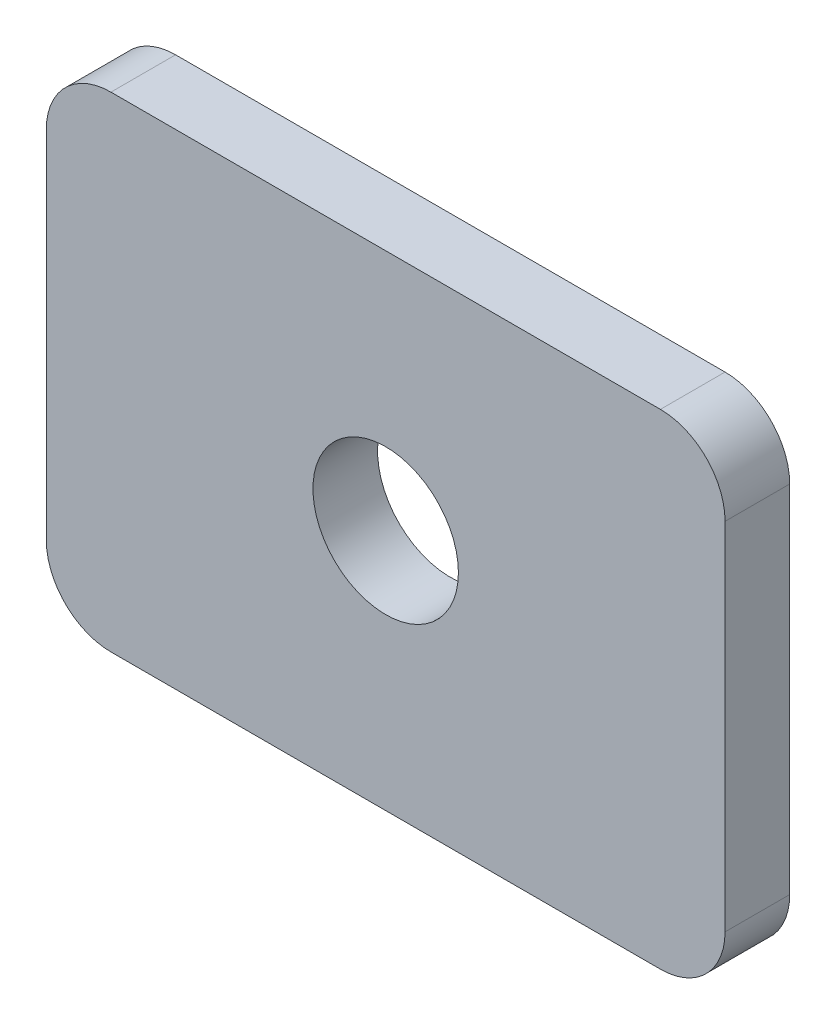
ISO-10303-21;
HEADER;
FILE_DESCRIPTION(('STEP AP214'),'2;1');
FILE_NAME('part.step','',(''),(''),'','','');
FILE_SCHEMA(('AUTOMOTIVE_DESIGN { 1 0 10303 214 1 1 1 1 }'));
ENDSEC;
DATA;
#1=APPLICATION_CONTEXT('core data for automotive mechanical design processes');
#2=APPLICATION_PROTOCOL_DEFINITION('international standard','automotive_design',2000,#1);
#3=PRODUCT_CONTEXT('',#1,'mechanical');
#4=PRODUCT('Part','Part','',(#3));
#5=PRODUCT_RELATED_PRODUCT_CATEGORY('part','',(#4));
#6=PRODUCT_DEFINITION_FORMATION('','',#4);
#7=PRODUCT_DEFINITION_CONTEXT('part definition',#1,'design');
#8=PRODUCT_DEFINITION('design','',#6,#7);
#9=PRODUCT_DEFINITION_SHAPE('','',#8);
#10=(LENGTH_UNIT() NAMED_UNIT(*) SI_UNIT(.MILLI.,.METRE.));
#11=(NAMED_UNIT(*) PLANE_ANGLE_UNIT() SI_UNIT($,.RADIAN.));
#12=(NAMED_UNIT(*) SI_UNIT($,.STERADIAN.) SOLID_ANGLE_UNIT());
#13=UNCERTAINTY_MEASURE_WITH_UNIT(LENGTH_MEASURE(1.E-05),#10,'distance_accuracy_value','');
#14=(GEOMETRIC_REPRESENTATION_CONTEXT(3) GLOBAL_UNCERTAINTY_ASSIGNED_CONTEXT((#13)) GLOBAL_UNIT_ASSIGNED_CONTEXT((#10,
#11,#12)) REPRESENTATION_CONTEXT('',''));
#15=CARTESIAN_POINT('',(0.,0.,0.));
#16=DIRECTION('',(0.,0.,1.));
#17=DIRECTION('',(1.,0.,0.));
#18=AXIS2_PLACEMENT_3D('',#15,#16,#17);
#19=CARTESIAN_POINT('',(10.5,7.5,-2.));
#20=DIRECTION('',(1.,0.,0.));
#21=DIRECTION('',(0.,0.,-1.));
#22=AXIS2_PLACEMENT_3D('',#19,#20,#21);
#23=PLANE('',#22);
#24=DIRECTION('',(0.,1.,0.));
#25=VECTOR('',#24,1.);
#26=CARTESIAN_POINT('',(10.5,7.5,-2.));
#27=LINE('',#26,#25);
#28=CARTESIAN_POINT('',(10.5,-5.5,-2.));
#29=VERTEX_POINT('',#28);
#30=CARTESIAN_POINT('',(10.5,5.5,-2.));
#31=VERTEX_POINT('',#30);
#32=EDGE_CURVE('E163',#29,#31,#27,.T.);
#33=ORIENTED_EDGE('',*,*,#32,.T.);
#34=DIRECTION('',(0.,0.,1.));
#35=VECTOR('',#34,1.);
#36=CARTESIAN_POINT('',(10.5,5.5,-2.));
#37=LINE('',#36,#35);
#38=CARTESIAN_POINT('',(10.5,5.5,0.));
#39=VERTEX_POINT('',#38);
#40=EDGE_CURVE('E117',#31,#39,#37,.T.);
#41=ORIENTED_EDGE('',*,*,#40,.T.);
#42=DIRECTION('',(0.,1.,0.));
#43=VECTOR('',#42,1.);
#44=CARTESIAN_POINT('',(10.5,7.5,0.));
#45=LINE('',#44,#43);
#46=CARTESIAN_POINT('',(10.5,-5.5,0.));
#47=VERTEX_POINT('',#46);
#48=EDGE_CURVE('E101',#47,#39,#45,.T.);
#49=ORIENTED_EDGE('',*,*,#48,.F.);
#50=DIRECTION('',(0.,0.,1.));
#51=VECTOR('',#50,1.);
#52=CARTESIAN_POINT('',(10.5,-5.5,-2.));
#53=LINE('',#52,#51);
#54=EDGE_CURVE('E114',#47,#29,#53,.F.);
#55=ORIENTED_EDGE('',*,*,#54,.T.);
#56=EDGE_LOOP('',(#33,#41,#49,#55));
#57=FACE_BOUND('',#56,.T.);
#58=ADVANCED_FACE('F32',(#57),#23,.T.);
#59=CARTESIAN_POINT('',(-10.5,-7.5,-2.));
#60=DIRECTION('',(0.,-1.,0.));
#61=DIRECTION('',(1.,0.,0.));
#62=AXIS2_PLACEMENT_3D('',#59,#60,#61);
#63=PLANE('',#62);
#64=DIRECTION('',(1.,0.,0.));
#65=VECTOR('',#64,1.);
#66=CARTESIAN_POINT('',(-10.5,-7.5,-2.));
#67=LINE('',#66,#65);
#68=CARTESIAN_POINT('',(-8.5,-7.5,-2.));
#69=VERTEX_POINT('',#68);
#70=CARTESIAN_POINT('',(8.49999999999999,-7.5,-2.));
#71=VERTEX_POINT('',#70);
#72=EDGE_CURVE('E124',#69,#71,#67,.T.);
#73=ORIENTED_EDGE('',*,*,#72,.T.);
#74=DIRECTION('',(0.,0.,1.));
#75=VECTOR('',#74,1.);
#76=CARTESIAN_POINT('',(8.5,-7.5,-2.));
#77=LINE('',#76,#75);
#78=CARTESIAN_POINT('',(8.49999999999999,-7.5,0.));
#79=VERTEX_POINT('',#78);
#80=EDGE_CURVE('E150',#71,#79,#77,.T.);
#81=ORIENTED_EDGE('',*,*,#80,.T.);
#82=DIRECTION('',(1.,0.,0.));
#83=VECTOR('',#82,1.);
#84=CARTESIAN_POINT('',(-10.5,-7.5,0.));
#85=LINE('',#84,#83);
#86=CARTESIAN_POINT('',(-8.5,-7.5,0.));
#87=VERTEX_POINT('',#86);
#88=EDGE_CURVE('E103',#87,#79,#85,.T.);
#89=ORIENTED_EDGE('',*,*,#88,.F.);
#90=DIRECTION('',(0.,0.,1.));
#91=VECTOR('',#90,1.);
#92=CARTESIAN_POINT('',(-8.5,-7.5,-2.));
#93=LINE('',#92,#91);
#94=EDGE_CURVE('E148',#87,#69,#93,.F.);
#95=ORIENTED_EDGE('',*,*,#94,.T.);
#96=EDGE_LOOP('',(#73,#81,#89,#95));
#97=FACE_BOUND('',#96,.T.);
#98=ADVANCED_FACE('F152',(#97),#63,.T.);
#99=CARTESIAN_POINT('',(-10.5,7.5,-2.));
#100=DIRECTION('',(-1.,0.,0.));
#101=DIRECTION('',(0.,0.,1.));
#102=AXIS2_PLACEMENT_3D('',#99,#100,#101);
#103=PLANE('',#102);
#104=DIRECTION('',(0.,-1.,0.));
#105=VECTOR('',#104,1.);
#106=CARTESIAN_POINT('',(-10.5,7.5,-2.));
#107=LINE('',#106,#105);
#108=CARTESIAN_POINT('',(-10.5,5.5,-2.));
#109=VERTEX_POINT('',#108);
#110=CARTESIAN_POINT('',(-10.5,-5.5,-2.));
#111=VERTEX_POINT('',#110);
#112=EDGE_CURVE('E129',#109,#111,#107,.T.);
#113=ORIENTED_EDGE('',*,*,#112,.T.);
#114=DIRECTION('',(0.,0.,1.));
#115=VECTOR('',#114,1.);
#116=CARTESIAN_POINT('',(-10.5,-5.5,-2.));
#117=LINE('',#116,#115);
#118=CARTESIAN_POINT('',(-10.5,-5.5,0.));
#119=VERTEX_POINT('',#118);
#120=EDGE_CURVE('E11',#111,#119,#117,.T.);
#121=ORIENTED_EDGE('',*,*,#120,.T.);
#122=DIRECTION('',(0.,-1.,0.));
#123=VECTOR('',#122,1.);
#124=CARTESIAN_POINT('',(-10.5,7.5,0.));
#125=LINE('',#124,#123);
#126=CARTESIAN_POINT('',(-10.5,5.5,0.));
#127=VERTEX_POINT('',#126);
#128=EDGE_CURVE('E161',#127,#119,#125,.T.);
#129=ORIENTED_EDGE('',*,*,#128,.F.);
#130=DIRECTION('',(0.,0.,1.));
#131=VECTOR('',#130,1.);
#132=CARTESIAN_POINT('',(-10.5,5.5,-2.));
#133=LINE('',#132,#131);
#134=EDGE_CURVE('E40',#127,#109,#133,.F.);
#135=ORIENTED_EDGE('',*,*,#134,.T.);
#136=EDGE_LOOP('',(#113,#121,#129,#135));
#137=FACE_BOUND('',#136,.T.);
#138=ADVANCED_FACE('F160',(#137),#103,.T.);
#139=CARTESIAN_POINT('',(-10.5,7.5,-2.));
#140=DIRECTION('',(0.,1.,0.));
#141=DIRECTION('',(-1.,0.,0.));
#142=AXIS2_PLACEMENT_3D('',#139,#140,#141);
#143=PLANE('',#142);
#144=DIRECTION('',(-1.,0.,0.));
#145=VECTOR('',#144,1.);
#146=CARTESIAN_POINT('',(-10.5,7.5,0.));
#147=LINE('',#146,#145);
#148=CARTESIAN_POINT('',(8.49999999999999,7.5,0.));
#149=VERTEX_POINT('',#148);
#150=CARTESIAN_POINT('',(-8.5,7.5,0.));
#151=VERTEX_POINT('',#150);
#152=EDGE_CURVE('E118',#149,#151,#147,.T.);
#153=ORIENTED_EDGE('',*,*,#152,.F.);
#154=DIRECTION('',(0.,0.,1.));
#155=VECTOR('',#154,1.);
#156=CARTESIAN_POINT('',(8.5,7.5,-2.));
#157=LINE('',#156,#155);
#158=CARTESIAN_POINT('',(8.49999999999999,7.5,-2.));
#159=VERTEX_POINT('',#158);
#160=EDGE_CURVE('E140',#149,#159,#157,.F.);
#161=ORIENTED_EDGE('',*,*,#160,.T.);
#162=DIRECTION('',(-1.,0.,0.));
#163=VECTOR('',#162,1.);
#164=CARTESIAN_POINT('',(-10.5,7.5,-2.));
#165=LINE('',#164,#163);
#166=CARTESIAN_POINT('',(-8.5,7.5,-2.));
#167=VERTEX_POINT('',#166);
#168=EDGE_CURVE('E167',#159,#167,#165,.T.);
#169=ORIENTED_EDGE('',*,*,#168,.T.);
#170=DIRECTION('',(0.,0.,1.));
#171=VECTOR('',#170,1.);
#172=CARTESIAN_POINT('',(-8.5,7.5,-2.));
#173=LINE('',#172,#171);
#174=EDGE_CURVE('E137',#167,#151,#173,.T.);
#175=ORIENTED_EDGE('',*,*,#174,.T.);
#176=EDGE_LOOP('',(#153,#161,#169,#175));
#177=FACE_BOUND('',#176,.T.);
#178=ADVANCED_FACE('F190',(#177),#143,.T.);
#179=CARTESIAN_POINT('',(0.,0.,-2.));
#180=DIRECTION('',(0.,0.,1.));
#181=DIRECTION('',(1.,0.,0.));
#182=AXIS2_PLACEMENT_3D('',#179,#180,#181);
#183=PLANE('',#182);
#184=CARTESIAN_POINT('',(0.,0.,-2.));
#185=DIRECTION('',(0.,0.,1.));
#186=DIRECTION('',(1.,0.,0.));
#187=AXIS2_PLACEMENT_3D('',#184,#185,#186);
#188=CIRCLE('',#187,2.25);
#189=CARTESIAN_POINT('',(2.25,0.,-2.));
#190=VERTEX_POINT('',#189);
#191=EDGE_CURVE('E119',#190,#190,#188,.T.);
#192=ORIENTED_EDGE('',*,*,#191,.T.);
#193=EDGE_LOOP('',(#192));
#194=FACE_BOUND('',#193,.T.);
#195=ORIENTED_EDGE('',*,*,#168,.F.);
#196=CARTESIAN_POINT('',(8.5,5.5,-2.));
#197=DIRECTION('',(0.,0.,1.));
#198=DIRECTION('',(1.,0.,0.));
#199=AXIS2_PLACEMENT_3D('',#196,#197,#198);
#200=CIRCLE('',#199,2.);
#201=EDGE_CURVE('E146',#159,#31,#200,.F.);
#202=ORIENTED_EDGE('',*,*,#201,.T.);
#203=ORIENTED_EDGE('',*,*,#32,.F.);
#204=CARTESIAN_POINT('',(8.5,-5.5,-2.));
#205=DIRECTION('',(0.,0.,1.));
#206=DIRECTION('',(1.,0.,0.));
#207=AXIS2_PLACEMENT_3D('',#204,#205,#206);
#208=CIRCLE('',#207,2.);
#209=EDGE_CURVE('E123',#29,#71,#208,.F.);
#210=ORIENTED_EDGE('',*,*,#209,.T.);
#211=ORIENTED_EDGE('',*,*,#72,.F.);
#212=CARTESIAN_POINT('',(-8.5,-5.5,-2.));
#213=DIRECTION('',(0.,0.,1.));
#214=DIRECTION('',(1.,0.,0.));
#215=AXIS2_PLACEMENT_3D('',#212,#213,#214);
#216=CIRCLE('',#215,2.);
#217=EDGE_CURVE('E47',#69,#111,#216,.F.);
#218=ORIENTED_EDGE('',*,*,#217,.T.);
#219=ORIENTED_EDGE('',*,*,#112,.F.);
#220=CARTESIAN_POINT('',(-8.5,5.5,-2.));
#221=DIRECTION('',(0.,0.,1.));
#222=DIRECTION('',(1.,0.,0.));
#223=AXIS2_PLACEMENT_3D('',#220,#221,#222);
#224=CIRCLE('',#223,2.);
#225=EDGE_CURVE('E142',#109,#167,#224,.F.);
#226=ORIENTED_EDGE('',*,*,#225,.T.);
#227=EDGE_LOOP('',(#195,#202,#203,#210,#211,#218,#219,#226));
#228=FACE_BOUND('',#227,.T.);
#229=ADVANCED_FACE('F155',(#194,#228),#183,.F.);
#230=CARTESIAN_POINT('',(0.,0.,0.));
#231=DIRECTION('',(0.,0.,1.));
#232=DIRECTION('',(1.,0.,0.));
#233=AXIS2_PLACEMENT_3D('',#230,#231,#232);
#234=PLANE('',#233);
#235=CARTESIAN_POINT('',(0.,0.,0.));
#236=DIRECTION('',(0.,0.,1.));
#237=DIRECTION('',(1.,0.,0.));
#238=AXIS2_PLACEMENT_3D('',#235,#236,#237);
#239=CIRCLE('',#238,2.25);
#240=CARTESIAN_POINT('',(2.25,0.,0.));
#241=VERTEX_POINT('',#240);
#242=EDGE_CURVE('E171',#241,#241,#239,.T.);
#243=ORIENTED_EDGE('',*,*,#242,.F.);
#244=EDGE_LOOP('',(#243));
#245=FACE_BOUND('',#244,.T.);
#246=ORIENTED_EDGE('',*,*,#48,.T.);
#247=CARTESIAN_POINT('',(8.5,5.5,0.));
#248=DIRECTION('',(0.,0.,1.));
#249=DIRECTION('',(1.,0.,0.));
#250=AXIS2_PLACEMENT_3D('',#247,#248,#249);
#251=CIRCLE('',#250,2.);
#252=EDGE_CURVE('E108',#39,#149,#251,.T.);
#253=ORIENTED_EDGE('',*,*,#252,.T.);
#254=ORIENTED_EDGE('',*,*,#152,.T.);
#255=CARTESIAN_POINT('',(-8.5,5.5,0.));
#256=DIRECTION('',(0.,0.,1.));
#257=DIRECTION('',(1.,0.,0.));
#258=AXIS2_PLACEMENT_3D('',#255,#256,#257);
#259=CIRCLE('',#258,2.);
#260=EDGE_CURVE('E126',#151,#127,#259,.T.);
#261=ORIENTED_EDGE('',*,*,#260,.T.);
#262=ORIENTED_EDGE('',*,*,#128,.T.);
#263=CARTESIAN_POINT('',(-8.5,-5.5,0.));
#264=DIRECTION('',(0.,0.,1.));
#265=DIRECTION('',(1.,0.,0.));
#266=AXIS2_PLACEMENT_3D('',#263,#264,#265);
#267=CIRCLE('',#266,2.);
#268=EDGE_CURVE('E109',#119,#87,#267,.T.);
#269=ORIENTED_EDGE('',*,*,#268,.T.);
#270=ORIENTED_EDGE('',*,*,#88,.T.);
#271=CARTESIAN_POINT('',(8.5,-5.5,0.));
#272=DIRECTION('',(0.,0.,1.));
#273=DIRECTION('',(1.,0.,0.));
#274=AXIS2_PLACEMENT_3D('',#271,#272,#273);
#275=CIRCLE('',#274,2.);
#276=EDGE_CURVE('E98',#79,#47,#275,.T.);
#277=ORIENTED_EDGE('',*,*,#276,.T.);
#278=EDGE_LOOP('',(#246,#253,#254,#261,#262,#269,#270,#277));
#279=FACE_BOUND('',#278,.T.);
#280=ADVANCED_FACE('F100',(#245,#279),#234,.T.);
#281=CARTESIAN_POINT('',(0.,0.,-2.));
#282=DIRECTION('',(0.,0.,1.));
#283=DIRECTION('',(1.,0.,0.));
#284=AXIS2_PLACEMENT_3D('',#281,#282,#283);
#285=CYLINDRICAL_SURFACE('',#284,2.25);
#286=ORIENTED_EDGE('',*,*,#191,.F.);
#287=EDGE_LOOP('',(#286));
#288=FACE_BOUND('',#287,.T.);
#289=ORIENTED_EDGE('',*,*,#242,.T.);
#290=EDGE_LOOP('',(#289));
#291=FACE_BOUND('',#290,.T.);
#292=ADVANCED_FACE('F178',(#288,#291),#285,.F.);
#293=CARTESIAN_POINT('',(8.5,5.5,-2.));
#294=DIRECTION('',(0.,0.,1.));
#295=DIRECTION('',(1.,0.,0.));
#296=AXIS2_PLACEMENT_3D('',#293,#294,#295);
#297=CYLINDRICAL_SURFACE('',#296,2.);
#298=ORIENTED_EDGE('',*,*,#201,.F.);
#299=ORIENTED_EDGE('',*,*,#160,.F.);
#300=ORIENTED_EDGE('',*,*,#252,.F.);
#301=ORIENTED_EDGE('',*,*,#40,.F.);
#302=EDGE_LOOP('',(#298,#299,#300,#301));
#303=FACE_BOUND('',#302,.T.);
#304=ADVANCED_FACE('F181',(#303),#297,.T.);
#305=CARTESIAN_POINT('',(8.5,-5.5,-2.));
#306=DIRECTION('',(0.,0.,1.));
#307=DIRECTION('',(1.,0.,0.));
#308=AXIS2_PLACEMENT_3D('',#305,#306,#307);
#309=CYLINDRICAL_SURFACE('',#308,2.);
#310=ORIENTED_EDGE('',*,*,#209,.F.);
#311=ORIENTED_EDGE('',*,*,#54,.F.);
#312=ORIENTED_EDGE('',*,*,#276,.F.);
#313=ORIENTED_EDGE('',*,*,#80,.F.);
#314=EDGE_LOOP('',(#310,#311,#312,#313));
#315=FACE_BOUND('',#314,.T.);
#316=ADVANCED_FACE('F122',(#315),#309,.T.);
#317=CARTESIAN_POINT('',(-8.5,-5.5,-2.));
#318=DIRECTION('',(0.,0.,1.));
#319=DIRECTION('',(1.,0.,0.));
#320=AXIS2_PLACEMENT_3D('',#317,#318,#319);
#321=CYLINDRICAL_SURFACE('',#320,2.);
#322=ORIENTED_EDGE('',*,*,#217,.F.);
#323=ORIENTED_EDGE('',*,*,#94,.F.);
#324=ORIENTED_EDGE('',*,*,#268,.F.);
#325=ORIENTED_EDGE('',*,*,#120,.F.);
#326=EDGE_LOOP('',(#322,#323,#324,#325));
#327=FACE_BOUND('',#326,.T.);
#328=ADVANCED_FACE('F158',(#327),#321,.T.);
#329=CARTESIAN_POINT('',(-8.5,5.5,-2.));
#330=DIRECTION('',(0.,0.,1.));
#331=DIRECTION('',(1.,0.,0.));
#332=AXIS2_PLACEMENT_3D('',#329,#330,#331);
#333=CYLINDRICAL_SURFACE('',#332,2.);
#334=ORIENTED_EDGE('',*,*,#225,.F.);
#335=ORIENTED_EDGE('',*,*,#134,.F.);
#336=ORIENTED_EDGE('',*,*,#260,.F.);
#337=ORIENTED_EDGE('',*,*,#174,.F.);
#338=EDGE_LOOP('',(#334,#335,#336,#337));
#339=FACE_BOUND('',#338,.T.);
#340=ADVANCED_FACE('F34',(#339),#333,.T.);
#341=CLOSED_SHELL('',(#58,#98,#138,#178,#229,#280,#292,#304,#316,#328,#340));
#342=MANIFOLD_SOLID_BREP('B2',#341);
#343=ADVANCED_BREP_SHAPE_REPRESENTATION('',(#18,#342),#14);
#344=SHAPE_DEFINITION_REPRESENTATION(#9,#343);
ENDSEC;
END-ISO-10303-21;
